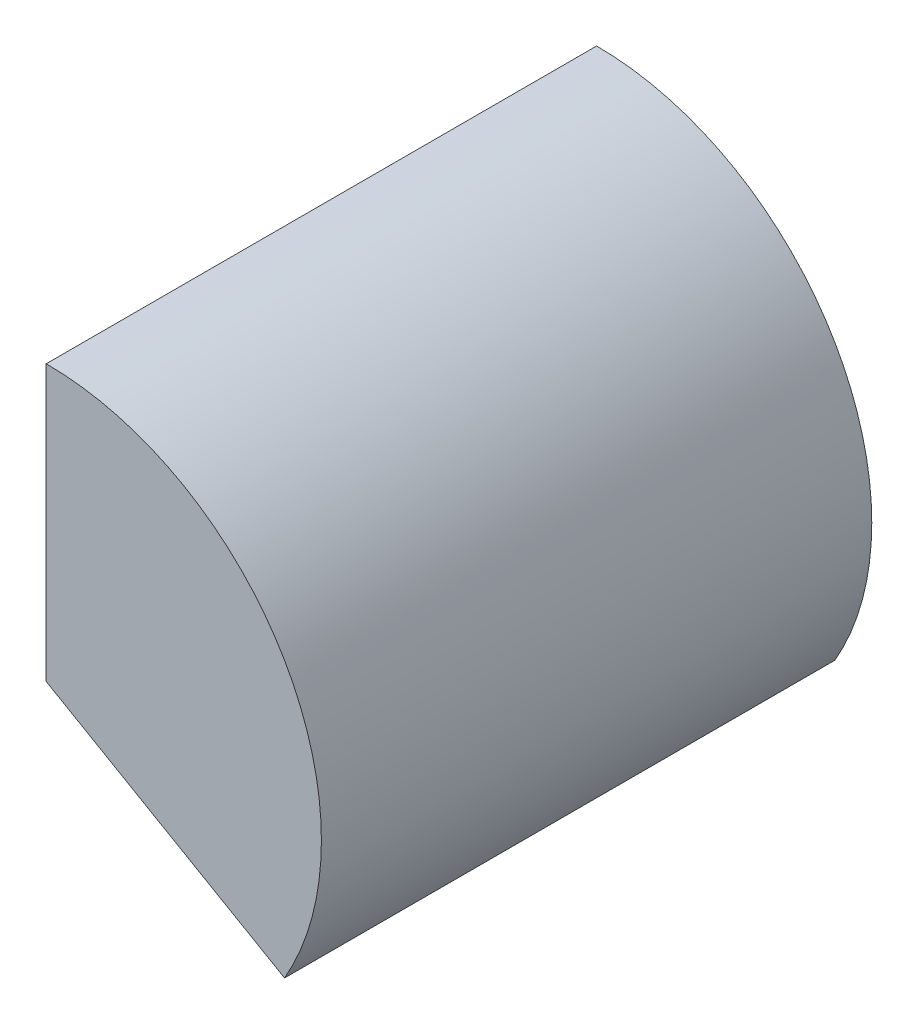
ISO-10303-21;
HEADER;
FILE_DESCRIPTION(('STEP AP214'),'2;1');
FILE_NAME('part.step','',(''),(''),'','','');
FILE_SCHEMA(('AUTOMOTIVE_DESIGN { 1 0 10303 214 1 1 1 1 }'));
ENDSEC;
DATA;
#1=APPLICATION_CONTEXT('core data for automotive mechanical design processes');
#2=APPLICATION_PROTOCOL_DEFINITION('international standard','automotive_design',2000,#1);
#3=PRODUCT_CONTEXT('',#1,'mechanical');
#4=PRODUCT('Part','Part','',(#3));
#5=PRODUCT_RELATED_PRODUCT_CATEGORY('part','',(#4));
#6=PRODUCT_DEFINITION_FORMATION('','',#4);
#7=PRODUCT_DEFINITION_CONTEXT('part definition',#1,'design');
#8=PRODUCT_DEFINITION('design','',#6,#7);
#9=PRODUCT_DEFINITION_SHAPE('','',#8);
#10=(LENGTH_UNIT() NAMED_UNIT(*) SI_UNIT(.MILLI.,.METRE.));
#11=(NAMED_UNIT(*) PLANE_ANGLE_UNIT() SI_UNIT($,.RADIAN.));
#12=(NAMED_UNIT(*) SI_UNIT($,.STERADIAN.) SOLID_ANGLE_UNIT());
#13=UNCERTAINTY_MEASURE_WITH_UNIT(LENGTH_MEASURE(1.E-05),#10,'distance_accuracy_value','');
#14=(GEOMETRIC_REPRESENTATION_CONTEXT(3) GLOBAL_UNCERTAINTY_ASSIGNED_CONTEXT((#13)) GLOBAL_UNIT_ASSIGNED_CONTEXT((#10,
#11,#12)) REPRESENTATION_CONTEXT('',''));
#15=CARTESIAN_POINT('',(0.,0.,0.));
#16=DIRECTION('',(0.,0.,1.));
#17=DIRECTION('',(1.,0.,0.));
#18=AXIS2_PLACEMENT_3D('',#15,#16,#17);
#19=CARTESIAN_POINT('',(0.,0.,50.));
#20=DIRECTION('',(0.499999999999998,0.86602540378444,0.));
#21=DIRECTION('',(-0.86602540378444,0.499999999999998,0.));
#22=AXIS2_PLACEMENT_3D('',#19,#20,#21);
#23=PLANE('',#22);
#24=DIRECTION('',(0.86602540378444,-0.499999999999998,0.));
#25=VECTOR('',#24,1.);
#26=CARTESIAN_POINT('',(0.,0.,0.));
#27=LINE('',#26,#25);
#28=CARTESIAN_POINT('',(0.,0.,0.));
#29=VERTEX_POINT('',#28);
#30=CARTESIAN_POINT('',(21.650635094611,-12.5,0.));
#31=VERTEX_POINT('',#30);
#32=EDGE_CURVE('E80',#29,#31,#27,.T.);
#33=ORIENTED_EDGE('',*,*,#32,.T.);
#34=DIRECTION('',(0.,0.,-1.));
#35=VECTOR('',#34,1.);
#36=CARTESIAN_POINT('',(21.650635094611,-12.5,50.));
#37=LINE('',#36,#35);
#38=CARTESIAN_POINT('',(21.650635094611,-12.5,50.));
#39=VERTEX_POINT('',#38);
#40=EDGE_CURVE('E11',#39,#31,#37,.T.);
#41=ORIENTED_EDGE('',*,*,#40,.F.);
#42=DIRECTION('',(0.86602540378444,-0.499999999999998,0.));
#43=VECTOR('',#42,1.);
#44=CARTESIAN_POINT('',(0.,0.,50.));
#45=LINE('',#44,#43);
#46=CARTESIAN_POINT('',(0.,0.,50.));
#47=VERTEX_POINT('',#46);
#48=EDGE_CURVE('E73',#47,#39,#45,.T.);
#49=ORIENTED_EDGE('',*,*,#48,.F.);
#50=DIRECTION('',(0.,0.,-1.));
#51=VECTOR('',#50,1.);
#52=CARTESIAN_POINT('',(0.,0.,50.));
#53=LINE('',#52,#51);
#54=EDGE_CURVE('E81',#47,#29,#53,.T.);
#55=ORIENTED_EDGE('',*,*,#54,.T.);
#56=EDGE_LOOP('',(#33,#41,#49,#55));
#57=FACE_BOUND('',#56,.T.);
#58=ADVANCED_FACE('F33',(#57),#23,.F.);
#59=CARTESIAN_POINT('',(0.,0.,50.));
#60=DIRECTION('',(0.,0.,-1.));
#61=DIRECTION('',(-1.,0.,0.));
#62=AXIS2_PLACEMENT_3D('',#59,#60,#61);
#63=CYLINDRICAL_SURFACE('',#62,25.);
#64=CARTESIAN_POINT('',(0.,0.,0.));
#65=DIRECTION('',(0.,0.,1.));
#66=DIRECTION('',(1.,0.,0.));
#67=AXIS2_PLACEMENT_3D('',#64,#65,#66);
#68=CIRCLE('',#67,25.);
#69=CARTESIAN_POINT('',(0.,25.,0.));
#70=VERTEX_POINT('',#69);
#71=EDGE_CURVE('E61',#31,#70,#68,.T.);
#72=ORIENTED_EDGE('',*,*,#71,.T.);
#73=DIRECTION('',(0.,0.,-1.));
#74=VECTOR('',#73,1.);
#75=CARTESIAN_POINT('',(0.,25.,50.));
#76=LINE('',#75,#74);
#77=CARTESIAN_POINT('',(0.,25.,50.));
#78=VERTEX_POINT('',#77);
#79=EDGE_CURVE('E41',#78,#70,#76,.T.);
#80=ORIENTED_EDGE('',*,*,#79,.F.);
#81=CARTESIAN_POINT('',(0.,0.,50.));
#82=DIRECTION('',(0.,0.,1.));
#83=DIRECTION('',(1.,0.,0.));
#84=AXIS2_PLACEMENT_3D('',#81,#82,#83);
#85=CIRCLE('',#84,25.);
#86=EDGE_CURVE('E69',#39,#78,#85,.T.);
#87=ORIENTED_EDGE('',*,*,#86,.F.);
#88=ORIENTED_EDGE('',*,*,#40,.T.);
#89=EDGE_LOOP('',(#72,#80,#87,#88));
#90=FACE_BOUND('',#89,.T.);
#91=ADVANCED_FACE('F70',(#90),#63,.T.);
#92=CARTESIAN_POINT('',(0.,25.,50.));
#93=DIRECTION('',(1.,0.,0.));
#94=DIRECTION('',(0.,0.,-1.));
#95=AXIS2_PLACEMENT_3D('',#92,#93,#94);
#96=PLANE('',#95);
#97=DIRECTION('',(0.,-1.,0.));
#98=VECTOR('',#97,1.);
#99=CARTESIAN_POINT('',(0.,25.,0.));
#100=LINE('',#99,#98);
#101=EDGE_CURVE('E66',#70,#29,#100,.T.);
#102=ORIENTED_EDGE('',*,*,#101,.T.);
#103=ORIENTED_EDGE('',*,*,#54,.F.);
#104=DIRECTION('',(0.,-1.,0.));
#105=VECTOR('',#104,1.);
#106=CARTESIAN_POINT('',(0.,25.,50.));
#107=LINE('',#106,#105);
#108=EDGE_CURVE('E49',#78,#47,#107,.T.);
#109=ORIENTED_EDGE('',*,*,#108,.F.);
#110=ORIENTED_EDGE('',*,*,#79,.T.);
#111=EDGE_LOOP('',(#102,#103,#109,#110));
#112=FACE_BOUND('',#111,.T.);
#113=ADVANCED_FACE('F92',(#112),#96,.F.);
#114=CARTESIAN_POINT('',(0.,0.,50.));
#115=DIRECTION('',(0.,0.,1.));
#116=DIRECTION('',(1.,0.,0.));
#117=AXIS2_PLACEMENT_3D('',#114,#115,#116);
#118=PLANE('',#117);
#119=ORIENTED_EDGE('',*,*,#48,.T.);
#120=ORIENTED_EDGE('',*,*,#86,.T.);
#121=ORIENTED_EDGE('',*,*,#108,.T.);
#122=EDGE_LOOP('',(#119,#120,#121));
#123=FACE_BOUND('',#122,.T.);
#124=ADVANCED_FACE('F76',(#123),#118,.T.);
#125=CARTESIAN_POINT('',(0.,0.,0.));
#126=DIRECTION('',(0.,0.,1.));
#127=DIRECTION('',(1.,0.,0.));
#128=AXIS2_PLACEMENT_3D('',#125,#126,#127);
#129=PLANE('',#128);
#130=CARTESIAN_POINT('',(11.9164119523066,5.55397758220536,0.));
#131=DIRECTION('',(0.,0.,-1.));
#132=DIRECTION('',(-1.,0.,0.));
#133=AXIS2_PLACEMENT_3D('',#130,#131,#132);
#134=CIRCLE('',#133,5.);
#135=CARTESIAN_POINT('',(6.91641195230661,5.55397758220536,0.));
#136=VERTEX_POINT('',#135);
#137=EDGE_CURVE('E87',#136,#136,#134,.T.);
#138=ORIENTED_EDGE('',*,*,#137,.F.);
#139=EDGE_LOOP('',(#138));
#140=FACE_BOUND('',#139,.T.);
#141=ORIENTED_EDGE('',*,*,#32,.F.);
#142=ORIENTED_EDGE('',*,*,#101,.F.);
#143=ORIENTED_EDGE('',*,*,#71,.F.);
#144=EDGE_LOOP('',(#141,#142,#143));
#145=FACE_BOUND('',#144,.T.);
#146=ADVANCED_FACE('F93',(#140,#145),#129,.F.);
#147=CARTESIAN_POINT('',(11.9164119523066,5.55397758220536,10.));
#148=DIRECTION('',(0.,0.,-1.));
#149=DIRECTION('',(-1.,0.,0.));
#150=AXIS2_PLACEMENT_3D('',#147,#148,#149);
#151=CYLINDRICAL_SURFACE('',#150,5.);
#152=CARTESIAN_POINT('',(11.9164119523066,5.55397758220536,10.));
#153=DIRECTION('',(0.,0.,-1.));
#154=DIRECTION('',(-1.,0.,0.));
#155=AXIS2_PLACEMENT_3D('',#152,#153,#154);
#156=CIRCLE('',#155,5.);
#157=CARTESIAN_POINT('',(6.91641195230661,5.55397758220536,10.));
#158=VERTEX_POINT('',#157);
#159=EDGE_CURVE('E83',#158,#158,#156,.T.);
#160=ORIENTED_EDGE('',*,*,#159,.F.);
#161=EDGE_LOOP('',(#160));
#162=FACE_BOUND('',#161,.T.);
#163=ORIENTED_EDGE('',*,*,#137,.T.);
#164=EDGE_LOOP('',(#163));
#165=FACE_BOUND('',#164,.T.);
#166=ADVANCED_FACE('F95',(#162,#165),#151,.F.);
#167=CARTESIAN_POINT('',(11.9164119523066,5.55397758220536,10.));
#168=DIRECTION('',(0.,0.,-1.));
#169=DIRECTION('',(-1.,0.,0.));
#170=AXIS2_PLACEMENT_3D('',#167,#168,#169);
#171=PLANE('',#170);
#172=ORIENTED_EDGE('',*,*,#159,.T.);
#173=EDGE_LOOP('',(#172));
#174=FACE_BOUND('',#173,.T.);
#175=ADVANCED_FACE('F102',(#174),#171,.T.);
#176=CLOSED_SHELL('',(#58,#91,#113,#124,#146,#166,#175));
#177=MANIFOLD_SOLID_BREP('B2',#176);
#178=ADVANCED_BREP_SHAPE_REPRESENTATION('',(#18,#177),#14);
#179=SHAPE_DEFINITION_REPRESENTATION(#9,#178);
ENDSEC;
END-ISO-10303-21;
